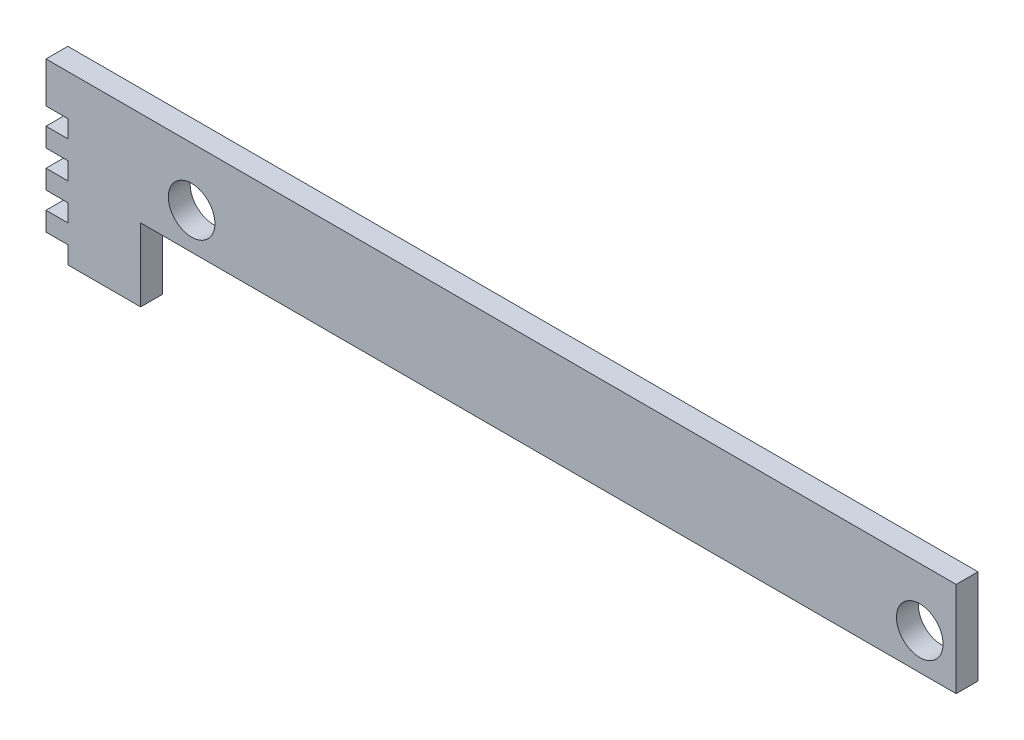
ISO-10303-21;
HEADER;
FILE_DESCRIPTION(('STEP AP214'),'2;1');
FILE_NAME('part.step','',(''),(''),'','','');
FILE_SCHEMA(('AUTOMOTIVE_DESIGN { 1 0 10303 214 1 1 1 1 }'));
ENDSEC;
DATA;
#1=APPLICATION_CONTEXT('core data for automotive mechanical design processes');
#2=APPLICATION_PROTOCOL_DEFINITION('international standard','automotive_design',2000,#1);
#3=PRODUCT_CONTEXT('',#1,'mechanical');
#4=PRODUCT('Part','Part','',(#3));
#5=PRODUCT_RELATED_PRODUCT_CATEGORY('part','',(#4));
#6=PRODUCT_DEFINITION_FORMATION('','',#4);
#7=PRODUCT_DEFINITION_CONTEXT('part definition',#1,'design');
#8=PRODUCT_DEFINITION('design','',#6,#7);
#9=PRODUCT_DEFINITION_SHAPE('','',#8);
#10=(LENGTH_UNIT() NAMED_UNIT(*) SI_UNIT(.MILLI.,.METRE.));
#11=(NAMED_UNIT(*) PLANE_ANGLE_UNIT() SI_UNIT($,.RADIAN.));
#12=(NAMED_UNIT(*) SI_UNIT($,.STERADIAN.) SOLID_ANGLE_UNIT());
#13=UNCERTAINTY_MEASURE_WITH_UNIT(LENGTH_MEASURE(1.E-05),#10,'distance_accuracy_value','');
#14=(GEOMETRIC_REPRESENTATION_CONTEXT(3) GLOBAL_UNCERTAINTY_ASSIGNED_CONTEXT((#13)) GLOBAL_UNIT_ASSIGNED_CONTEXT((#10,
#11,#12)) REPRESENTATION_CONTEXT('',''));
#15=CARTESIAN_POINT('',(0.,0.,0.));
#16=DIRECTION('',(0.,0.,1.));
#17=DIRECTION('',(1.,0.,0.));
#18=AXIS2_PLACEMENT_3D('',#15,#16,#17);
#19=CARTESIAN_POINT('',(0.,0.,6.));
#20=DIRECTION('',(0.,0.,1.));
#21=DIRECTION('',(1.,0.,0.));
#22=AXIS2_PLACEMENT_3D('',#19,#20,#21);
#23=PLANE('',#22);
#24=CARTESIAN_POINT('',(-210.,10.,6.));
#25=DIRECTION('',(0.,0.,1.));
#26=DIRECTION('',(1.,0.,0.));
#27=AXIS2_PLACEMENT_3D('',#24,#25,#26);
#28=CIRCLE('',#27,6.39999999999999);
#29=CARTESIAN_POINT('',(-203.6,10.,6.));
#30=VERTEX_POINT('',#29);
#31=EDGE_CURVE('E227',#30,#30,#28,.T.);
#32=ORIENTED_EDGE('',*,*,#31,.F.);
#33=EDGE_LOOP('',(#32));
#34=FACE_BOUND('',#33,.T.);
#35=DIRECTION('',(1.,0.,0.));
#36=VECTOR('',#35,1.);
#37=CARTESIAN_POINT('',(-59.8,0.,6.));
#38=LINE('',#37,#36);
#39=CARTESIAN_POINT('',(-224.,0.,6.));
#40=VERTEX_POINT('',#39);
#41=CARTESIAN_POINT('',(0.,0.,6.));
#42=VERTEX_POINT('',#41);
#43=EDGE_CURVE('E63',#40,#42,#38,.T.);
#44=ORIENTED_EDGE('',*,*,#43,.T.);
#45=DIRECTION('',(0.,1.,0.));
#46=VECTOR('',#45,1.);
#47=CARTESIAN_POINT('',(0.,0.,6.));
#48=LINE('',#47,#46);
#49=CARTESIAN_POINT('',(0.,26.,6.));
#50=VERTEX_POINT('',#49);
#51=EDGE_CURVE('E143',#42,#50,#48,.T.);
#52=ORIENTED_EDGE('',*,*,#51,.T.);
#53=DIRECTION('',(-1.,0.,0.));
#54=VECTOR('',#53,1.);
#55=CARTESIAN_POINT('',(-250.,26.,6.));
#56=LINE('',#55,#54);
#57=CARTESIAN_POINT('',(-250.,26.,6.));
#58=VERTEX_POINT('',#57);
#59=EDGE_CURVE('E350',#50,#58,#56,.T.);
#60=ORIENTED_EDGE('',*,*,#59,.T.);
#61=DIRECTION('',(0.,-1.,0.));
#62=VECTOR('',#61,1.);
#63=CARTESIAN_POINT('',(-250.,20.,6.));
#64=LINE('',#63,#62);
#65=CARTESIAN_POINT('',(-250.,14.8,6.));
#66=VERTEX_POINT('',#65);
#67=EDGE_CURVE('E370',#58,#66,#64,.T.);
#68=ORIENTED_EDGE('',*,*,#67,.T.);
#69=DIRECTION('',(1.,0.,0.));
#70=VECTOR('',#69,1.);
#71=CARTESIAN_POINT('',(-250.,14.8,6.));
#72=LINE('',#71,#70);
#73=CARTESIAN_POINT('',(-244.,14.8,6.));
#74=VERTEX_POINT('',#73);
#75=EDGE_CURVE('E366',#66,#74,#72,.T.);
#76=ORIENTED_EDGE('',*,*,#75,.T.);
#77=DIRECTION('',(0.,-1.,0.));
#78=VECTOR('',#77,1.);
#79=CARTESIAN_POINT('',(-244.,14.8,6.));
#80=LINE('',#79,#78);
#81=CARTESIAN_POINT('',(-244.,10.,6.));
#82=VERTEX_POINT('',#81);
#83=EDGE_CURVE('E369',#74,#82,#80,.T.);
#84=ORIENTED_EDGE('',*,*,#83,.T.);
#85=DIRECTION('',(-1.,0.,0.));
#86=VECTOR('',#85,1.);
#87=CARTESIAN_POINT('',(-244.,10.,6.));
#88=LINE('',#87,#86);
#89=CARTESIAN_POINT('',(-250.,10.,6.));
#90=VERTEX_POINT('',#89);
#91=EDGE_CURVE('E374',#82,#90,#88,.T.);
#92=ORIENTED_EDGE('',*,*,#91,.T.);
#93=DIRECTION('',(0.,-1.,0.));
#94=VECTOR('',#93,1.);
#95=CARTESIAN_POINT('',(-250.,10.,6.));
#96=LINE('',#95,#94);
#97=CARTESIAN_POINT('',(-250.,4.8,6.));
#98=VERTEX_POINT('',#97);
#99=EDGE_CURVE('E381',#90,#98,#96,.T.);
#100=ORIENTED_EDGE('',*,*,#99,.T.);
#101=DIRECTION('',(1.,0.,0.));
#102=VECTOR('',#101,1.);
#103=CARTESIAN_POINT('',(-250.,4.8,6.));
#104=LINE('',#103,#102);
#105=CARTESIAN_POINT('',(-244.,4.8,6.));
#106=VERTEX_POINT('',#105);
#107=EDGE_CURVE('E384',#98,#106,#104,.T.);
#108=ORIENTED_EDGE('',*,*,#107,.T.);
#109=DIRECTION('',(0.,-1.,0.));
#110=VECTOR('',#109,1.);
#111=CARTESIAN_POINT('',(-244.,4.8,6.));
#112=LINE('',#111,#110);
#113=CARTESIAN_POINT('',(-244.,0.,6.));
#114=VERTEX_POINT('',#113);
#115=EDGE_CURVE('E387',#106,#114,#112,.T.);
#116=ORIENTED_EDGE('',*,*,#115,.T.);
#117=DIRECTION('',(-1.,0.,0.));
#118=VECTOR('',#117,1.);
#119=CARTESIAN_POINT('',(-244.,0.,6.));
#120=LINE('',#119,#118);
#121=CARTESIAN_POINT('',(-250.,0.,6.));
#122=VERTEX_POINT('',#121);
#123=EDGE_CURVE('E390',#114,#122,#120,.T.);
#124=ORIENTED_EDGE('',*,*,#123,.T.);
#125=DIRECTION('',(0.,-1.,0.));
#126=VECTOR('',#125,1.);
#127=CARTESIAN_POINT('',(-250.,0.,6.));
#128=LINE('',#127,#126);
#129=CARTESIAN_POINT('',(-250.,-5.2,6.));
#130=VERTEX_POINT('',#129);
#131=EDGE_CURVE('E393',#122,#130,#128,.T.);
#132=ORIENTED_EDGE('',*,*,#131,.T.);
#133=DIRECTION('',(1.,0.,0.));
#134=VECTOR('',#133,1.);
#135=CARTESIAN_POINT('',(-250.,-5.2,6.));
#136=LINE('',#135,#134);
#137=CARTESIAN_POINT('',(-244.,-5.2,6.));
#138=VERTEX_POINT('',#137);
#139=EDGE_CURVE('E396',#130,#138,#136,.T.);
#140=ORIENTED_EDGE('',*,*,#139,.T.);
#141=DIRECTION('',(0.,-1.,0.));
#142=VECTOR('',#141,1.);
#143=CARTESIAN_POINT('',(-244.,-5.2,6.));
#144=LINE('',#143,#142);
#145=CARTESIAN_POINT('',(-244.,-9.99999999999999,6.));
#146=VERTEX_POINT('',#145);
#147=EDGE_CURVE('E399',#138,#146,#144,.T.);
#148=ORIENTED_EDGE('',*,*,#147,.T.);
#149=DIRECTION('',(-1.,0.,0.));
#150=VECTOR('',#149,1.);
#151=CARTESIAN_POINT('',(-244.,-9.99999999999999,6.));
#152=LINE('',#151,#150);
#153=CARTESIAN_POINT('',(-250.,-9.99999999999999,6.));
#154=VERTEX_POINT('',#153);
#155=EDGE_CURVE('E402',#146,#154,#152,.T.);
#156=ORIENTED_EDGE('',*,*,#155,.T.);
#157=DIRECTION('',(0.,-1.,0.));
#158=VECTOR('',#157,1.);
#159=CARTESIAN_POINT('',(-250.,-9.99999999999999,6.));
#160=LINE('',#159,#158);
#161=CARTESIAN_POINT('',(-250.,-15.2,6.));
#162=VERTEX_POINT('',#161);
#163=EDGE_CURVE('E405',#154,#162,#160,.T.);
#164=ORIENTED_EDGE('',*,*,#163,.T.);
#165=DIRECTION('',(1.,0.,0.));
#166=VECTOR('',#165,1.);
#167=CARTESIAN_POINT('',(-250.,-15.2,6.));
#168=LINE('',#167,#166);
#169=CARTESIAN_POINT('',(-244.,-15.2,6.));
#170=VERTEX_POINT('',#169);
#171=EDGE_CURVE('E199',#162,#170,#168,.T.);
#172=ORIENTED_EDGE('',*,*,#171,.T.);
#173=DIRECTION('',(0.,-1.,0.));
#174=VECTOR('',#173,1.);
#175=CARTESIAN_POINT('',(-244.,-15.2,6.));
#176=LINE('',#175,#174);
#177=CARTESIAN_POINT('',(-244.,-20.,6.));
#178=VERTEX_POINT('',#177);
#179=EDGE_CURVE('E193',#170,#178,#176,.T.);
#180=ORIENTED_EDGE('',*,*,#179,.T.);
#181=DIRECTION('',(1.,0.,0.));
#182=VECTOR('',#181,1.);
#183=CARTESIAN_POINT('',(-244.,-20.,6.));
#184=LINE('',#183,#182);
#185=CARTESIAN_POINT('',(-224.,-20.,6.));
#186=VERTEX_POINT('',#185);
#187=EDGE_CURVE('E197',#178,#186,#184,.T.);
#188=ORIENTED_EDGE('',*,*,#187,.T.);
#189=DIRECTION('',(0.,1.,0.));
#190=VECTOR('',#189,1.);
#191=CARTESIAN_POINT('',(-224.,-20.,6.));
#192=LINE('',#191,#190);
#193=EDGE_CURVE('E216',#186,#40,#192,.T.);
#194=ORIENTED_EDGE('',*,*,#193,.T.);
#195=EDGE_LOOP('',(#44,#52,#60,#68,#76,#84,#92,#100,#108,#116,#124,#132,#140,#148,#156,#164,
#172,#180,#188,#194));
#196=FACE_BOUND('',#195,.T.);
#197=CARTESIAN_POINT('',(-10.,10.,6.));
#198=DIRECTION('',(0.,0.,1.));
#199=DIRECTION('',(1.,0.,0.));
#200=AXIS2_PLACEMENT_3D('',#197,#198,#199);
#201=CIRCLE('',#200,6.4);
#202=CARTESIAN_POINT('',(-3.60000000000001,10.,6.));
#203=VERTEX_POINT('',#202);
#204=EDGE_CURVE('E430',#203,#203,#201,.T.);
#205=ORIENTED_EDGE('',*,*,#204,.F.);
#206=EDGE_LOOP('',(#205));
#207=FACE_BOUND('',#206,.T.);
#208=ADVANCED_FACE('F45',(#34,#196,#207),#23,.T.);
#209=CARTESIAN_POINT('',(0.,0.,0.));
#210=DIRECTION('',(0.,0.,1.));
#211=DIRECTION('',(1.,0.,0.));
#212=AXIS2_PLACEMENT_3D('',#209,#210,#211);
#213=PLANE('',#212);
#214=DIRECTION('',(0.,1.,0.));
#215=VECTOR('',#214,1.);
#216=CARTESIAN_POINT('',(0.,0.,0.));
#217=LINE('',#216,#215);
#218=CARTESIAN_POINT('',(0.,0.,0.));
#219=VERTEX_POINT('',#218);
#220=CARTESIAN_POINT('',(0.,26.,0.));
#221=VERTEX_POINT('',#220);
#222=EDGE_CURVE('E223',#219,#221,#217,.T.);
#223=ORIENTED_EDGE('',*,*,#222,.F.);
#224=DIRECTION('',(1.,0.,0.));
#225=VECTOR('',#224,1.);
#226=CARTESIAN_POINT('',(-224.,0.,0.));
#227=LINE('',#226,#225);
#228=CARTESIAN_POINT('',(-224.,0.,0.));
#229=VERTEX_POINT('',#228);
#230=EDGE_CURVE('E279',#229,#219,#227,.T.);
#231=ORIENTED_EDGE('',*,*,#230,.F.);
#232=DIRECTION('',(0.,1.,0.));
#233=VECTOR('',#232,1.);
#234=CARTESIAN_POINT('',(-224.,-20.,0.));
#235=LINE('',#234,#233);
#236=CARTESIAN_POINT('',(-224.,-20.,0.));
#237=VERTEX_POINT('',#236);
#238=EDGE_CURVE('E136',#237,#229,#235,.T.);
#239=ORIENTED_EDGE('',*,*,#238,.F.);
#240=DIRECTION('',(1.,0.,0.));
#241=VECTOR('',#240,1.);
#242=CARTESIAN_POINT('',(-244.,-20.,0.));
#243=LINE('',#242,#241);
#244=CARTESIAN_POINT('',(-244.,-20.,0.));
#245=VERTEX_POINT('',#244);
#246=EDGE_CURVE('E129',#245,#237,#243,.T.);
#247=ORIENTED_EDGE('',*,*,#246,.F.);
#248=DIRECTION('',(0.,-1.,0.));
#249=VECTOR('',#248,1.);
#250=CARTESIAN_POINT('',(-244.,-15.2,0.));
#251=LINE('',#250,#249);
#252=CARTESIAN_POINT('',(-244.,-15.2,0.));
#253=VERTEX_POINT('',#252);
#254=EDGE_CURVE('E208',#253,#245,#251,.T.);
#255=ORIENTED_EDGE('',*,*,#254,.F.);
#256=DIRECTION('',(1.,0.,0.));
#257=VECTOR('',#256,1.);
#258=CARTESIAN_POINT('',(-250.,-15.2,0.));
#259=LINE('',#258,#257);
#260=CARTESIAN_POINT('',(-250.,-15.2,0.));
#261=VERTEX_POINT('',#260);
#262=EDGE_CURVE('E270',#261,#253,#259,.T.);
#263=ORIENTED_EDGE('',*,*,#262,.F.);
#264=DIRECTION('',(0.,-1.,0.));
#265=VECTOR('',#264,1.);
#266=CARTESIAN_POINT('',(-250.,-9.99999999999999,0.));
#267=LINE('',#266,#265);
#268=CARTESIAN_POINT('',(-250.,-9.99999999999999,0.));
#269=VERTEX_POINT('',#268);
#270=EDGE_CURVE('E267',#269,#261,#267,.T.);
#271=ORIENTED_EDGE('',*,*,#270,.F.);
#272=DIRECTION('',(-1.,0.,0.));
#273=VECTOR('',#272,1.);
#274=CARTESIAN_POINT('',(-244.,-9.99999999999999,0.));
#275=LINE('',#274,#273);
#276=CARTESIAN_POINT('',(-244.,-9.99999999999999,0.));
#277=VERTEX_POINT('',#276);
#278=EDGE_CURVE('E264',#277,#269,#275,.T.);
#279=ORIENTED_EDGE('',*,*,#278,.F.);
#280=DIRECTION('',(0.,-1.,0.));
#281=VECTOR('',#280,1.);
#282=CARTESIAN_POINT('',(-244.,-5.2,0.));
#283=LINE('',#282,#281);
#284=CARTESIAN_POINT('',(-244.,-5.2,0.));
#285=VERTEX_POINT('',#284);
#286=EDGE_CURVE('E261',#285,#277,#283,.T.);
#287=ORIENTED_EDGE('',*,*,#286,.F.);
#288=DIRECTION('',(1.,0.,0.));
#289=VECTOR('',#288,1.);
#290=CARTESIAN_POINT('',(-250.,-5.2,0.));
#291=LINE('',#290,#289);
#292=CARTESIAN_POINT('',(-250.,-5.2,0.));
#293=VERTEX_POINT('',#292);
#294=EDGE_CURVE('E258',#293,#285,#291,.T.);
#295=ORIENTED_EDGE('',*,*,#294,.F.);
#296=DIRECTION('',(0.,-1.,0.));
#297=VECTOR('',#296,1.);
#298=CARTESIAN_POINT('',(-250.,0.,0.));
#299=LINE('',#298,#297);
#300=CARTESIAN_POINT('',(-250.,0.,0.));
#301=VERTEX_POINT('',#300);
#302=EDGE_CURVE('E255',#301,#293,#299,.T.);
#303=ORIENTED_EDGE('',*,*,#302,.F.);
#304=DIRECTION('',(-1.,0.,0.));
#305=VECTOR('',#304,1.);
#306=CARTESIAN_POINT('',(-244.,0.,0.));
#307=LINE('',#306,#305);
#308=CARTESIAN_POINT('',(-244.,0.,0.));
#309=VERTEX_POINT('',#308);
#310=EDGE_CURVE('E252',#309,#301,#307,.T.);
#311=ORIENTED_EDGE('',*,*,#310,.F.);
#312=DIRECTION('',(0.,-1.,0.));
#313=VECTOR('',#312,1.);
#314=CARTESIAN_POINT('',(-244.,4.8,0.));
#315=LINE('',#314,#313);
#316=CARTESIAN_POINT('',(-244.,4.8,0.));
#317=VERTEX_POINT('',#316);
#318=EDGE_CURVE('E249',#317,#309,#315,.T.);
#319=ORIENTED_EDGE('',*,*,#318,.F.);
#320=DIRECTION('',(1.,0.,0.));
#321=VECTOR('',#320,1.);
#322=CARTESIAN_POINT('',(-250.,4.8,0.));
#323=LINE('',#322,#321);
#324=CARTESIAN_POINT('',(-250.,4.8,0.));
#325=VERTEX_POINT('',#324);
#326=EDGE_CURVE('E246',#325,#317,#323,.T.);
#327=ORIENTED_EDGE('',*,*,#326,.F.);
#328=DIRECTION('',(0.,-1.,0.));
#329=VECTOR('',#328,1.);
#330=CARTESIAN_POINT('',(-250.,10.,0.));
#331=LINE('',#330,#329);
#332=CARTESIAN_POINT('',(-250.,10.,0.));
#333=VERTEX_POINT('',#332);
#334=EDGE_CURVE('E243',#333,#325,#331,.T.);
#335=ORIENTED_EDGE('',*,*,#334,.F.);
#336=DIRECTION('',(-1.,0.,0.));
#337=VECTOR('',#336,1.);
#338=CARTESIAN_POINT('',(-244.,10.,0.));
#339=LINE('',#338,#337);
#340=CARTESIAN_POINT('',(-244.,10.,0.));
#341=VERTEX_POINT('',#340);
#342=EDGE_CURVE('E240',#341,#333,#339,.T.);
#343=ORIENTED_EDGE('',*,*,#342,.F.);
#344=DIRECTION('',(0.,-1.,0.));
#345=VECTOR('',#344,1.);
#346=CARTESIAN_POINT('',(-244.,14.8,0.));
#347=LINE('',#346,#345);
#348=CARTESIAN_POINT('',(-244.,14.8,0.));
#349=VERTEX_POINT('',#348);
#350=EDGE_CURVE('E237',#349,#341,#347,.T.);
#351=ORIENTED_EDGE('',*,*,#350,.F.);
#352=DIRECTION('',(1.,0.,0.));
#353=VECTOR('',#352,1.);
#354=CARTESIAN_POINT('',(-250.,14.8,0.));
#355=LINE('',#354,#353);
#356=CARTESIAN_POINT('',(-250.,14.8,0.));
#357=VERTEX_POINT('',#356);
#358=EDGE_CURVE('E234',#357,#349,#355,.T.);
#359=ORIENTED_EDGE('',*,*,#358,.F.);
#360=DIRECTION('',(0.,-1.,0.));
#361=VECTOR('',#360,1.);
#362=CARTESIAN_POINT('',(-250.,20.,0.));
#363=LINE('',#362,#361);
#364=CARTESIAN_POINT('',(-250.,26.,0.));
#365=VERTEX_POINT('',#364);
#366=EDGE_CURVE('E231',#365,#357,#363,.T.);
#367=ORIENTED_EDGE('',*,*,#366,.F.);
#368=DIRECTION('',(-1.,0.,0.));
#369=VECTOR('',#368,1.);
#370=CARTESIAN_POINT('',(-250.,26.,0.));
#371=LINE('',#370,#369);
#372=EDGE_CURVE('E226',#221,#365,#371,.T.);
#373=ORIENTED_EDGE('',*,*,#372,.F.);
#374=EDGE_LOOP('',(#223,#231,#239,#247,#255,#263,#271,#279,#287,#295,#303,#311,#319,#327,#335,
#343,#351,#359,#367,#373));
#375=FACE_BOUND('',#374,.T.);
#376=CARTESIAN_POINT('',(-210.,10.,0.));
#377=DIRECTION('',(0.,0.,1.));
#378=DIRECTION('',(1.,0.,0.));
#379=AXIS2_PLACEMENT_3D('',#376,#377,#378);
#380=CIRCLE('',#379,6.39999999999999);
#381=CARTESIAN_POINT('',(-203.6,10.,0.));
#382=VERTEX_POINT('',#381);
#383=EDGE_CURVE('E425',#382,#382,#380,.T.);
#384=ORIENTED_EDGE('',*,*,#383,.T.);
#385=EDGE_LOOP('',(#384));
#386=FACE_BOUND('',#385,.T.);
#387=CARTESIAN_POINT('',(-10.,10.,0.));
#388=DIRECTION('',(0.,0.,1.));
#389=DIRECTION('',(1.,0.,0.));
#390=AXIS2_PLACEMENT_3D('',#387,#388,#389);
#391=CIRCLE('',#390,6.4);
#392=CARTESIAN_POINT('',(-3.60000000000001,10.,0.));
#393=VERTEX_POINT('',#392);
#394=EDGE_CURVE('E434',#393,#393,#391,.T.);
#395=ORIENTED_EDGE('',*,*,#394,.T.);
#396=EDGE_LOOP('',(#395));
#397=FACE_BOUND('',#396,.T.);
#398=ADVANCED_FACE('F353',(#375,#386,#397),#213,.F.);
#399=CARTESIAN_POINT('',(0.,0.,6.));
#400=DIRECTION('',(-1.,0.,0.));
#401=DIRECTION('',(0.,0.,1.));
#402=AXIS2_PLACEMENT_3D('',#399,#400,#401);
#403=PLANE('',#402);
#404=ORIENTED_EDGE('',*,*,#222,.T.);
#405=DIRECTION('',(0.,0.,-1.));
#406=VECTOR('',#405,1.);
#407=CARTESIAN_POINT('',(0.,26.,6.));
#408=LINE('',#407,#406);
#409=EDGE_CURVE('E55',#50,#221,#408,.T.);
#410=ORIENTED_EDGE('',*,*,#409,.F.);
#411=ORIENTED_EDGE('',*,*,#51,.F.);
#412=DIRECTION('',(0.,0.,-1.));
#413=VECTOR('',#412,1.);
#414=CARTESIAN_POINT('',(0.,0.,6.));
#415=LINE('',#414,#413);
#416=EDGE_CURVE('E11',#42,#219,#415,.T.);
#417=ORIENTED_EDGE('',*,*,#416,.T.);
#418=EDGE_LOOP('',(#404,#410,#411,#417));
#419=FACE_BOUND('',#418,.T.);
#420=ADVANCED_FACE('F47',(#419),#403,.F.);
#421=CARTESIAN_POINT('',(-250.,26.,6.));
#422=DIRECTION('',(0.,-1.,0.));
#423=DIRECTION('',(0.,0.,-1.));
#424=AXIS2_PLACEMENT_3D('',#421,#422,#423);
#425=PLANE('',#424);
#426=ORIENTED_EDGE('',*,*,#372,.T.);
#427=DIRECTION('',(0.,0.,-1.));
#428=VECTOR('',#427,1.);
#429=CARTESIAN_POINT('',(-250.,26.,6.));
#430=LINE('',#429,#428);
#431=EDGE_CURVE('E340',#58,#365,#430,.T.);
#432=ORIENTED_EDGE('',*,*,#431,.F.);
#433=ORIENTED_EDGE('',*,*,#59,.F.);
#434=ORIENTED_EDGE('',*,*,#409,.T.);
#435=EDGE_LOOP('',(#426,#432,#433,#434));
#436=FACE_BOUND('',#435,.T.);
#437=ADVANCED_FACE('F348',(#436),#425,.F.);
#438=CARTESIAN_POINT('',(-250.,20.,6.));
#439=DIRECTION('',(1.,0.,0.));
#440=DIRECTION('',(0.,0.,-1.));
#441=AXIS2_PLACEMENT_3D('',#438,#439,#440);
#442=PLANE('',#441);
#443=ORIENTED_EDGE('',*,*,#366,.T.);
#444=DIRECTION('',(0.,0.,-1.));
#445=VECTOR('',#444,1.);
#446=CARTESIAN_POINT('',(-250.,14.8,6.));
#447=LINE('',#446,#445);
#448=EDGE_CURVE('E336',#66,#357,#447,.T.);
#449=ORIENTED_EDGE('',*,*,#448,.F.);
#450=ORIENTED_EDGE('',*,*,#67,.F.);
#451=ORIENTED_EDGE('',*,*,#431,.T.);
#452=EDGE_LOOP('',(#443,#449,#450,#451));
#453=FACE_BOUND('',#452,.T.);
#454=ADVANCED_FACE('F360',(#453),#442,.F.);
#455=CARTESIAN_POINT('',(-250.,14.8,6.));
#456=DIRECTION('',(0.,1.,0.));
#457=DIRECTION('',(0.,0.,1.));
#458=AXIS2_PLACEMENT_3D('',#455,#456,#457);
#459=PLANE('',#458);
#460=ORIENTED_EDGE('',*,*,#358,.T.);
#461=DIRECTION('',(0.,0.,-1.));
#462=VECTOR('',#461,1.);
#463=CARTESIAN_POINT('',(-244.,14.8,6.));
#464=LINE('',#463,#462);
#465=EDGE_CURVE('E332',#74,#349,#464,.T.);
#466=ORIENTED_EDGE('',*,*,#465,.F.);
#467=ORIENTED_EDGE('',*,*,#75,.F.);
#468=ORIENTED_EDGE('',*,*,#448,.T.);
#469=EDGE_LOOP('',(#460,#466,#467,#468));
#470=FACE_BOUND('',#469,.T.);
#471=ADVANCED_FACE('F364',(#470),#459,.F.);
#472=CARTESIAN_POINT('',(-244.,14.8,6.));
#473=DIRECTION('',(1.,0.,0.));
#474=DIRECTION('',(0.,0.,-1.));
#475=AXIS2_PLACEMENT_3D('',#472,#473,#474);
#476=PLANE('',#475);
#477=ORIENTED_EDGE('',*,*,#350,.T.);
#478=DIRECTION('',(0.,0.,-1.));
#479=VECTOR('',#478,1.);
#480=CARTESIAN_POINT('',(-244.,10.,6.));
#481=LINE('',#480,#479);
#482=EDGE_CURVE('E328',#82,#341,#481,.T.);
#483=ORIENTED_EDGE('',*,*,#482,.F.);
#484=ORIENTED_EDGE('',*,*,#83,.F.);
#485=ORIENTED_EDGE('',*,*,#465,.T.);
#486=EDGE_LOOP('',(#477,#483,#484,#485));
#487=FACE_BOUND('',#486,.T.);
#488=ADVANCED_FACE('F503',(#487),#476,.F.);
#489=CARTESIAN_POINT('',(-244.,10.,6.));
#490=DIRECTION('',(0.,-1.,0.));
#491=DIRECTION('',(0.,0.,-1.));
#492=AXIS2_PLACEMENT_3D('',#489,#490,#491);
#493=PLANE('',#492);
#494=ORIENTED_EDGE('',*,*,#342,.T.);
#495=DIRECTION('',(0.,0.,-1.));
#496=VECTOR('',#495,1.);
#497=CARTESIAN_POINT('',(-250.,10.,6.));
#498=LINE('',#497,#496);
#499=EDGE_CURVE('E324',#90,#333,#498,.T.);
#500=ORIENTED_EDGE('',*,*,#499,.F.);
#501=ORIENTED_EDGE('',*,*,#91,.F.);
#502=ORIENTED_EDGE('',*,*,#482,.T.);
#503=EDGE_LOOP('',(#494,#500,#501,#502));
#504=FACE_BOUND('',#503,.T.);
#505=ADVANCED_FACE('F499',(#504),#493,.F.);
#506=CARTESIAN_POINT('',(-250.,10.,6.));
#507=DIRECTION('',(1.,0.,0.));
#508=DIRECTION('',(0.,0.,-1.));
#509=AXIS2_PLACEMENT_3D('',#506,#507,#508);
#510=PLANE('',#509);
#511=ORIENTED_EDGE('',*,*,#334,.T.);
#512=DIRECTION('',(0.,0.,-1.));
#513=VECTOR('',#512,1.);
#514=CARTESIAN_POINT('',(-250.,4.8,6.));
#515=LINE('',#514,#513);
#516=EDGE_CURVE('E320',#98,#325,#515,.T.);
#517=ORIENTED_EDGE('',*,*,#516,.F.);
#518=ORIENTED_EDGE('',*,*,#99,.F.);
#519=ORIENTED_EDGE('',*,*,#499,.T.);
#520=EDGE_LOOP('',(#511,#517,#518,#519));
#521=FACE_BOUND('',#520,.T.);
#522=ADVANCED_FACE('F495',(#521),#510,.F.);
#523=CARTESIAN_POINT('',(-250.,4.8,6.));
#524=DIRECTION('',(0.,1.,0.));
#525=DIRECTION('',(0.,0.,1.));
#526=AXIS2_PLACEMENT_3D('',#523,#524,#525);
#527=PLANE('',#526);
#528=ORIENTED_EDGE('',*,*,#326,.T.);
#529=DIRECTION('',(0.,0.,-1.));
#530=VECTOR('',#529,1.);
#531=CARTESIAN_POINT('',(-244.,4.8,6.));
#532=LINE('',#531,#530);
#533=EDGE_CURVE('E316',#106,#317,#532,.T.);
#534=ORIENTED_EDGE('',*,*,#533,.F.);
#535=ORIENTED_EDGE('',*,*,#107,.F.);
#536=ORIENTED_EDGE('',*,*,#516,.T.);
#537=EDGE_LOOP('',(#528,#534,#535,#536));
#538=FACE_BOUND('',#537,.T.);
#539=ADVANCED_FACE('F491',(#538),#527,.F.);
#540=CARTESIAN_POINT('',(-244.,4.8,6.));
#541=DIRECTION('',(1.,0.,0.));
#542=DIRECTION('',(0.,0.,-1.));
#543=AXIS2_PLACEMENT_3D('',#540,#541,#542);
#544=PLANE('',#543);
#545=ORIENTED_EDGE('',*,*,#318,.T.);
#546=DIRECTION('',(0.,0.,-1.));
#547=VECTOR('',#546,1.);
#548=CARTESIAN_POINT('',(-244.,0.,6.));
#549=LINE('',#548,#547);
#550=EDGE_CURVE('E312',#114,#309,#549,.T.);
#551=ORIENTED_EDGE('',*,*,#550,.F.);
#552=ORIENTED_EDGE('',*,*,#115,.F.);
#553=ORIENTED_EDGE('',*,*,#533,.T.);
#554=EDGE_LOOP('',(#545,#551,#552,#553));
#555=FACE_BOUND('',#554,.T.);
#556=ADVANCED_FACE('F487',(#555),#544,.F.);
#557=CARTESIAN_POINT('',(-244.,0.,6.));
#558=DIRECTION('',(0.,-1.,0.));
#559=DIRECTION('',(0.,0.,-1.));
#560=AXIS2_PLACEMENT_3D('',#557,#558,#559);
#561=PLANE('',#560);
#562=ORIENTED_EDGE('',*,*,#310,.T.);
#563=DIRECTION('',(0.,0.,-1.));
#564=VECTOR('',#563,1.);
#565=CARTESIAN_POINT('',(-250.,0.,6.));
#566=LINE('',#565,#564);
#567=EDGE_CURVE('E308',#122,#301,#566,.T.);
#568=ORIENTED_EDGE('',*,*,#567,.F.);
#569=ORIENTED_EDGE('',*,*,#123,.F.);
#570=ORIENTED_EDGE('',*,*,#550,.T.);
#571=EDGE_LOOP('',(#562,#568,#569,#570));
#572=FACE_BOUND('',#571,.T.);
#573=ADVANCED_FACE('F483',(#572),#561,.F.);
#574=CARTESIAN_POINT('',(-250.,0.,6.));
#575=DIRECTION('',(1.,0.,0.));
#576=DIRECTION('',(0.,0.,-1.));
#577=AXIS2_PLACEMENT_3D('',#574,#575,#576);
#578=PLANE('',#577);
#579=ORIENTED_EDGE('',*,*,#302,.T.);
#580=DIRECTION('',(0.,0.,-1.));
#581=VECTOR('',#580,1.);
#582=CARTESIAN_POINT('',(-250.,-5.2,6.));
#583=LINE('',#582,#581);
#584=EDGE_CURVE('E304',#130,#293,#583,.T.);
#585=ORIENTED_EDGE('',*,*,#584,.F.);
#586=ORIENTED_EDGE('',*,*,#131,.F.);
#587=ORIENTED_EDGE('',*,*,#567,.T.);
#588=EDGE_LOOP('',(#579,#585,#586,#587));
#589=FACE_BOUND('',#588,.T.);
#590=ADVANCED_FACE('F479',(#589),#578,.F.);
#591=CARTESIAN_POINT('',(-250.,-5.2,6.));
#592=DIRECTION('',(0.,1.,0.));
#593=DIRECTION('',(0.,0.,1.));
#594=AXIS2_PLACEMENT_3D('',#591,#592,#593);
#595=PLANE('',#594);
#596=ORIENTED_EDGE('',*,*,#294,.T.);
#597=DIRECTION('',(0.,0.,-1.));
#598=VECTOR('',#597,1.);
#599=CARTESIAN_POINT('',(-244.,-5.2,6.));
#600=LINE('',#599,#598);
#601=EDGE_CURVE('E300',#138,#285,#600,.T.);
#602=ORIENTED_EDGE('',*,*,#601,.F.);
#603=ORIENTED_EDGE('',*,*,#139,.F.);
#604=ORIENTED_EDGE('',*,*,#584,.T.);
#605=EDGE_LOOP('',(#596,#602,#603,#604));
#606=FACE_BOUND('',#605,.T.);
#607=ADVANCED_FACE('F475',(#606),#595,.F.);
#608=CARTESIAN_POINT('',(-244.,-5.2,6.));
#609=DIRECTION('',(1.,0.,0.));
#610=DIRECTION('',(0.,0.,-1.));
#611=AXIS2_PLACEMENT_3D('',#608,#609,#610);
#612=PLANE('',#611);
#613=ORIENTED_EDGE('',*,*,#286,.T.);
#614=DIRECTION('',(0.,0.,-1.));
#615=VECTOR('',#614,1.);
#616=CARTESIAN_POINT('',(-244.,-9.99999999999999,6.));
#617=LINE('',#616,#615);
#618=EDGE_CURVE('E296',#146,#277,#617,.T.);
#619=ORIENTED_EDGE('',*,*,#618,.F.);
#620=ORIENTED_EDGE('',*,*,#147,.F.);
#621=ORIENTED_EDGE('',*,*,#601,.T.);
#622=EDGE_LOOP('',(#613,#619,#620,#621));
#623=FACE_BOUND('',#622,.T.);
#624=ADVANCED_FACE('F471',(#623),#612,.F.);
#625=CARTESIAN_POINT('',(-244.,-9.99999999999999,6.));
#626=DIRECTION('',(0.,-1.,0.));
#627=DIRECTION('',(0.,0.,-1.));
#628=AXIS2_PLACEMENT_3D('',#625,#626,#627);
#629=PLANE('',#628);
#630=ORIENTED_EDGE('',*,*,#278,.T.);
#631=DIRECTION('',(0.,0.,-1.));
#632=VECTOR('',#631,1.);
#633=CARTESIAN_POINT('',(-250.,-9.99999999999999,6.));
#634=LINE('',#633,#632);
#635=EDGE_CURVE('E292',#154,#269,#634,.T.);
#636=ORIENTED_EDGE('',*,*,#635,.F.);
#637=ORIENTED_EDGE('',*,*,#155,.F.);
#638=ORIENTED_EDGE('',*,*,#618,.T.);
#639=EDGE_LOOP('',(#630,#636,#637,#638));
#640=FACE_BOUND('',#639,.T.);
#641=ADVANCED_FACE('F468',(#640),#629,.F.);
#642=CARTESIAN_POINT('',(-250.,-9.99999999999999,6.));
#643=DIRECTION('',(1.,0.,0.));
#644=DIRECTION('',(0.,0.,-1.));
#645=AXIS2_PLACEMENT_3D('',#642,#643,#644);
#646=PLANE('',#645);
#647=ORIENTED_EDGE('',*,*,#270,.T.);
#648=DIRECTION('',(0.,0.,-1.));
#649=VECTOR('',#648,1.);
#650=CARTESIAN_POINT('',(-250.,-15.2,6.));
#651=LINE('',#650,#649);
#652=EDGE_CURVE('E288',#162,#261,#651,.T.);
#653=ORIENTED_EDGE('',*,*,#652,.F.);
#654=ORIENTED_EDGE('',*,*,#163,.F.);
#655=ORIENTED_EDGE('',*,*,#635,.T.);
#656=EDGE_LOOP('',(#647,#653,#654,#655));
#657=FACE_BOUND('',#656,.T.);
#658=ADVANCED_FACE('F413',(#657),#646,.F.);
#659=CARTESIAN_POINT('',(-250.,-15.2,6.));
#660=DIRECTION('',(0.,1.,0.));
#661=DIRECTION('',(0.,0.,1.));
#662=AXIS2_PLACEMENT_3D('',#659,#660,#661);
#663=PLANE('',#662);
#664=ORIENTED_EDGE('',*,*,#262,.T.);
#665=DIRECTION('',(0.,0.,-1.));
#666=VECTOR('',#665,1.);
#667=CARTESIAN_POINT('',(-244.,-15.2,6.));
#668=LINE('',#667,#666);
#669=EDGE_CURVE('E210',#170,#253,#668,.T.);
#670=ORIENTED_EDGE('',*,*,#669,.F.);
#671=ORIENTED_EDGE('',*,*,#171,.F.);
#672=ORIENTED_EDGE('',*,*,#652,.T.);
#673=EDGE_LOOP('',(#664,#670,#671,#672));
#674=FACE_BOUND('',#673,.T.);
#675=ADVANCED_FACE('F417',(#674),#663,.F.);
#676=CARTESIAN_POINT('',(-244.,-15.2,6.));
#677=DIRECTION('',(1.,0.,0.));
#678=DIRECTION('',(0.,0.,-1.));
#679=AXIS2_PLACEMENT_3D('',#676,#677,#678);
#680=PLANE('',#679);
#681=ORIENTED_EDGE('',*,*,#254,.T.);
#682=DIRECTION('',(0.,0.,-1.));
#683=VECTOR('',#682,1.);
#684=CARTESIAN_POINT('',(-244.,-20.,6.));
#685=LINE('',#684,#683);
#686=EDGE_CURVE('E205',#178,#245,#685,.T.);
#687=ORIENTED_EDGE('',*,*,#686,.F.);
#688=ORIENTED_EDGE('',*,*,#179,.F.);
#689=ORIENTED_EDGE('',*,*,#669,.T.);
#690=EDGE_LOOP('',(#681,#687,#688,#689));
#691=FACE_BOUND('',#690,.T.);
#692=ADVANCED_FACE('F206',(#691),#680,.F.);
#693=CARTESIAN_POINT('',(-244.,-20.,6.));
#694=DIRECTION('',(0.,1.,0.));
#695=DIRECTION('',(0.,0.,1.));
#696=AXIS2_PLACEMENT_3D('',#693,#694,#695);
#697=PLANE('',#696);
#698=ORIENTED_EDGE('',*,*,#246,.T.);
#699=DIRECTION('',(0.,0.,-1.));
#700=VECTOR('',#699,1.);
#701=CARTESIAN_POINT('',(-224.,-20.,6.));
#702=LINE('',#701,#700);
#703=EDGE_CURVE('E211',#186,#237,#702,.T.);
#704=ORIENTED_EDGE('',*,*,#703,.F.);
#705=ORIENTED_EDGE('',*,*,#187,.F.);
#706=ORIENTED_EDGE('',*,*,#686,.T.);
#707=EDGE_LOOP('',(#698,#704,#705,#706));
#708=FACE_BOUND('',#707,.T.);
#709=ADVANCED_FACE('F213',(#708),#697,.F.);
#710=CARTESIAN_POINT('',(-224.,-20.,6.));
#711=DIRECTION('',(-1.,0.,0.));
#712=DIRECTION('',(0.,0.,1.));
#713=AXIS2_PLACEMENT_3D('',#710,#711,#712);
#714=PLANE('',#713);
#715=ORIENTED_EDGE('',*,*,#238,.T.);
#716=DIRECTION('',(0.,0.,-1.));
#717=VECTOR('',#716,1.);
#718=CARTESIAN_POINT('',(-224.,0.,6.));
#719=LINE('',#718,#717);
#720=EDGE_CURVE('E219',#40,#229,#719,.T.);
#721=ORIENTED_EDGE('',*,*,#720,.F.);
#722=ORIENTED_EDGE('',*,*,#193,.F.);
#723=ORIENTED_EDGE('',*,*,#703,.T.);
#724=EDGE_LOOP('',(#715,#721,#722,#723));
#725=FACE_BOUND('',#724,.T.);
#726=ADVANCED_FACE('F419',(#725),#714,.F.);
#727=CARTESIAN_POINT('',(-224.,0.,6.));
#728=DIRECTION('',(0.,1.,0.));
#729=DIRECTION('',(-1.,0.,0.));
#730=AXIS2_PLACEMENT_3D('',#727,#728,#729);
#731=PLANE('',#730);
#732=ORIENTED_EDGE('',*,*,#230,.T.);
#733=ORIENTED_EDGE('',*,*,#416,.F.);
#734=ORIENTED_EDGE('',*,*,#43,.F.);
#735=ORIENTED_EDGE('',*,*,#720,.T.);
#736=EDGE_LOOP('',(#732,#733,#734,#735));
#737=FACE_BOUND('',#736,.T.);
#738=ADVANCED_FACE('F418',(#737),#731,.F.);
#739=CARTESIAN_POINT('',(-210.,10.,6.));
#740=DIRECTION('',(0.,0.,-1.));
#741=DIRECTION('',(-1.,0.,0.));
#742=AXIS2_PLACEMENT_3D('',#739,#740,#741);
#743=CYLINDRICAL_SURFACE('',#742,6.39999999999999);
#744=ORIENTED_EDGE('',*,*,#31,.T.);
#745=EDGE_LOOP('',(#744));
#746=FACE_BOUND('',#745,.T.);
#747=ORIENTED_EDGE('',*,*,#383,.F.);
#748=EDGE_LOOP('',(#747));
#749=FACE_BOUND('',#748,.T.);
#750=ADVANCED_FACE('F453',(#746,#749),#743,.F.);
#751=CARTESIAN_POINT('',(-10.,10.,6.));
#752=DIRECTION('',(0.,0.,-1.));
#753=DIRECTION('',(-1.,0.,0.));
#754=AXIS2_PLACEMENT_3D('',#751,#752,#753);
#755=CYLINDRICAL_SURFACE('',#754,6.4);
#756=ORIENTED_EDGE('',*,*,#204,.T.);
#757=EDGE_LOOP('',(#756));
#758=FACE_BOUND('',#757,.T.);
#759=ORIENTED_EDGE('',*,*,#394,.F.);
#760=EDGE_LOOP('',(#759));
#761=FACE_BOUND('',#760,.T.);
#762=ADVANCED_FACE('F442',(#758,#761),#755,.F.);
#763=CLOSED_SHELL('',(#208,#398,#420,#437,#454,#471,#488,#505,#522,#539,#556,#573,#590,#607,
#624,#641,#658,#675,#692,#709,#726,#738,#750,#762));
#764=MANIFOLD_SOLID_BREP('B2',#763);
#765=ADVANCED_BREP_SHAPE_REPRESENTATION('',(#18,#764),#14);
#766=SHAPE_DEFINITION_REPRESENTATION(#9,#765);
ENDSEC;
END-ISO-10303-21;
